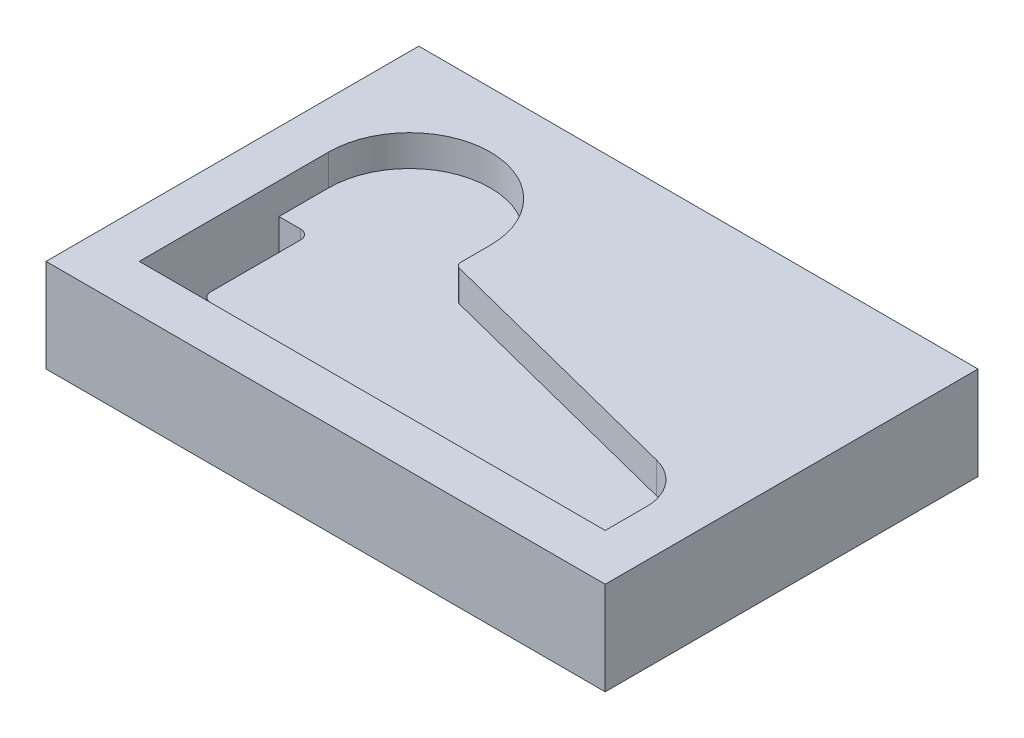
ISO-10303-21;
HEADER;
FILE_DESCRIPTION(('STEP AP214'),'2;1');
FILE_NAME('part.step','',(''),(''),'','','');
FILE_SCHEMA(('AUTOMOTIVE_DESIGN { 1 0 10303 214 1 1 1 1 }'));
ENDSEC;
DATA;
#1=APPLICATION_CONTEXT('core data for automotive mechanical design processes');
#2=APPLICATION_PROTOCOL_DEFINITION('international standard','automotive_design',2000,#1);
#3=PRODUCT_CONTEXT('',#1,'mechanical');
#4=PRODUCT('Part','Part','',(#3));
#5=PRODUCT_RELATED_PRODUCT_CATEGORY('part','',(#4));
#6=PRODUCT_DEFINITION_FORMATION('','',#4);
#7=PRODUCT_DEFINITION_CONTEXT('part definition',#1,'design');
#8=PRODUCT_DEFINITION('design','',#6,#7);
#9=PRODUCT_DEFINITION_SHAPE('','',#8);
#10=(LENGTH_UNIT() NAMED_UNIT(*) SI_UNIT(.MILLI.,.METRE.));
#11=(NAMED_UNIT(*) PLANE_ANGLE_UNIT() SI_UNIT($,.RADIAN.));
#12=(NAMED_UNIT(*) SI_UNIT($,.STERADIAN.) SOLID_ANGLE_UNIT());
#13=UNCERTAINTY_MEASURE_WITH_UNIT(LENGTH_MEASURE(1.E-05),#10,'distance_accuracy_value','');
#14=(GEOMETRIC_REPRESENTATION_CONTEXT(3) GLOBAL_UNCERTAINTY_ASSIGNED_CONTEXT((#13)) GLOBAL_UNIT_ASSIGNED_CONTEXT((#10,
#11,#12)) REPRESENTATION_CONTEXT('',''));
#15=CARTESIAN_POINT('',(0.,0.,0.));
#16=DIRECTION('',(0.,0.,1.));
#17=DIRECTION('',(1.,0.,0.));
#18=AXIS2_PLACEMENT_3D('',#15,#16,#17);
#19=CARTESIAN_POINT('',(0.,30.,0.));
#20=DIRECTION('',(0.,-1.,0.));
#21=DIRECTION('',(0.,0.,-1.));
#22=AXIS2_PLACEMENT_3D('',#19,#20,#21);
#23=PLANE('',#22);
#24=DIRECTION('',(0.,0.,-1.));
#25=VECTOR('',#24,1.);
#26=CARTESIAN_POINT('',(90.,30.,60.));
#27=LINE('',#26,#25);
#28=CARTESIAN_POINT('',(90.,30.,60.));
#29=VERTEX_POINT('',#28);
#30=CARTESIAN_POINT('',(90.,30.,-60.));
#31=VERTEX_POINT('',#30);
#32=EDGE_CURVE('E279',#29,#31,#27,.T.);
#33=ORIENTED_EDGE('',*,*,#32,.T.);
#34=DIRECTION('',(-1.,0.,0.));
#35=VECTOR('',#34,1.);
#36=CARTESIAN_POINT('',(-90.,30.,-60.));
#37=LINE('',#36,#35);
#38=CARTESIAN_POINT('',(-90.,30.,-60.));
#39=VERTEX_POINT('',#38);
#40=EDGE_CURVE('E282',#31,#39,#37,.T.);
#41=ORIENTED_EDGE('',*,*,#40,.T.);
#42=DIRECTION('',(0.,0.,1.));
#43=VECTOR('',#42,1.);
#44=CARTESIAN_POINT('',(-90.,30.,60.));
#45=LINE('',#44,#43);
#46=CARTESIAN_POINT('',(-90.,30.,60.));
#47=VERTEX_POINT('',#46);
#48=EDGE_CURVE('E285',#39,#47,#45,.T.);
#49=ORIENTED_EDGE('',*,*,#48,.T.);
#50=DIRECTION('',(1.,0.,0.));
#51=VECTOR('',#50,1.);
#52=CARTESIAN_POINT('',(-90.,30.,60.));
#53=LINE('',#52,#51);
#54=EDGE_CURVE('E287',#47,#29,#53,.T.);
#55=ORIENTED_EDGE('',*,*,#54,.T.);
#56=EDGE_LOOP('',(#33,#41,#49,#55));
#57=FACE_BOUND('',#56,.T.);
#58=DIRECTION('',(0.,0.,-1.));
#59=VECTOR('',#58,1.);
#60=CARTESIAN_POINT('',(75.,30.,20.));
#61=LINE('',#60,#59);
#62=CARTESIAN_POINT('',(75.,30.,45.));
#63=VERTEX_POINT('',#62);
#64=CARTESIAN_POINT('',(75.,30.,31.6538549296739));
#65=VERTEX_POINT('',#64);
#66=EDGE_CURVE('E186',#63,#65,#61,.T.);
#67=ORIENTED_EDGE('',*,*,#66,.F.);
#68=DIRECTION('',(-1.,0.,0.));
#69=VECTOR('',#68,1.);
#70=CARTESIAN_POINT('',(0.,30.,45.));
#71=LINE('',#70,#69);
#72=CARTESIAN_POINT('',(-75.,30.,45.));
#73=VERTEX_POINT('',#72);
#74=EDGE_CURVE('E170',#63,#73,#71,.T.);
#75=ORIENTED_EDGE('',*,*,#74,.T.);
#76=DIRECTION('',(0.,0.,1.));
#77=VECTOR('',#76,1.);
#78=CARTESIAN_POINT('',(-75.,30.,0.));
#79=LINE('',#78,#77);
#80=CARTESIAN_POINT('',(-75.,30.,-16.));
#81=VERTEX_POINT('',#80);
#82=EDGE_CURVE('E214',#81,#73,#79,.T.);
#83=ORIENTED_EDGE('',*,*,#82,.F.);
#84=CARTESIAN_POINT('',(-49.,30.,-16.));
#85=DIRECTION('',(0.,1.,0.));
#86=DIRECTION('',(0.,0.,1.));
#87=AXIS2_PLACEMENT_3D('',#84,#85,#86);
#88=CIRCLE('',#87,26.);
#89=CARTESIAN_POINT('',(-23.,30.,-16.));
#90=VERTEX_POINT('',#89);
#91=EDGE_CURVE('E243',#90,#81,#88,.T.);
#92=ORIENTED_EDGE('',*,*,#91,.F.);
#93=DIRECTION('',(0.,0.,1.));
#94=VECTOR('',#93,1.);
#95=CARTESIAN_POINT('',(-23.,30.,0.));
#96=LINE('',#95,#94);
#97=CARTESIAN_POINT('',(-23.,30.,-6.55384732395652));
#98=VERTEX_POINT('',#97);
#99=EDGE_CURVE('E219',#90,#98,#96,.T.);
#100=ORIENTED_EDGE('',*,*,#99,.T.);
#101=CARTESIAN_POINT('',(-21.,30.,-6.55384732395652));
#102=DIRECTION('',(0.,1.,0.));
#103=DIRECTION('',(0.,0.,1.));
#104=AXIS2_PLACEMENT_3D('',#101,#102,#103);
#105=CIRCLE('',#104,2.);
#106=CARTESIAN_POINT('',(-21.4943714873099,30.,-4.61591109370152));
#107=VERTEX_POINT('',#106);
#108=EDGE_CURVE('E274',#107,#98,#105,.F.);
#109=ORIENTED_EDGE('',*,*,#108,.F.);
#110=DIRECTION('',(-0.968968115127499,0.,-0.247185743654974));
#111=VECTOR('',#110,1.);
#112=CARTESIAN_POINT('',(-23.,30.,-5.));
#113=LINE('',#112,#111);
#114=CARTESIAN_POINT('',(63.7077861548246,30.,17.1193332027614));
#115=VERTEX_POINT('',#114);
#116=EDGE_CURVE('E58',#115,#107,#113,.T.);
#117=ORIENTED_EDGE('',*,*,#116,.F.);
#118=CARTESIAN_POINT('',(60.,30.,31.6538549296739));
#119=DIRECTION('',(0.,1.,0.));
#120=DIRECTION('',(0.,0.,1.));
#121=AXIS2_PLACEMENT_3D('',#118,#119,#120);
#122=CIRCLE('',#121,15.);
#123=EDGE_CURVE('E193',#65,#115,#122,.T.);
#124=ORIENTED_EDGE('',*,*,#123,.F.);
#125=EDGE_LOOP('',(#67,#75,#83,#92,#100,#109,#117,#124));
#126=FACE_BOUND('',#125,.T.);
#127=ADVANCED_FACE('F43',(#57,#126),#23,.F.);
#128=CARTESIAN_POINT('',(0.,0.,0.));
#129=DIRECTION('',(0.,-1.,0.));
#130=DIRECTION('',(0.,0.,-1.));
#131=AXIS2_PLACEMENT_3D('',#128,#129,#130);
#132=PLANE('',#131);
#133=DIRECTION('',(0.,0.,-1.));
#134=VECTOR('',#133,1.);
#135=CARTESIAN_POINT('',(90.,0.,60.));
#136=LINE('',#135,#134);
#137=CARTESIAN_POINT('',(90.,0.,60.));
#138=VERTEX_POINT('',#137);
#139=CARTESIAN_POINT('',(90.,0.,-60.));
#140=VERTEX_POINT('',#139);
#141=EDGE_CURVE('E278',#138,#140,#136,.T.);
#142=ORIENTED_EDGE('',*,*,#141,.F.);
#143=DIRECTION('',(1.,0.,0.));
#144=VECTOR('',#143,1.);
#145=CARTESIAN_POINT('',(-90.,0.,60.));
#146=LINE('',#145,#144);
#147=CARTESIAN_POINT('',(-90.,0.,60.));
#148=VERTEX_POINT('',#147);
#149=EDGE_CURVE('E283',#148,#138,#146,.T.);
#150=ORIENTED_EDGE('',*,*,#149,.F.);
#151=DIRECTION('',(0.,0.,1.));
#152=VECTOR('',#151,1.);
#153=CARTESIAN_POINT('',(-90.,0.,60.));
#154=LINE('',#153,#152);
#155=CARTESIAN_POINT('',(-90.,0.,-60.));
#156=VERTEX_POINT('',#155);
#157=EDGE_CURVE('E294',#156,#148,#154,.T.);
#158=ORIENTED_EDGE('',*,*,#157,.F.);
#159=DIRECTION('',(-1.,0.,0.));
#160=VECTOR('',#159,1.);
#161=CARTESIAN_POINT('',(-90.,0.,-60.));
#162=LINE('',#161,#160);
#163=EDGE_CURVE('E292',#140,#156,#162,.T.);
#164=ORIENTED_EDGE('',*,*,#163,.F.);
#165=EDGE_LOOP('',(#142,#150,#158,#164));
#166=FACE_BOUND('',#165,.T.);
#167=DIRECTION('',(1.,0.,0.));
#168=VECTOR('',#167,1.);
#169=CARTESIAN_POINT('',(-75.,0.,0.));
#170=LINE('',#169,#168);
#171=CARTESIAN_POINT('',(-75.,0.,0.));
#172=VERTEX_POINT('',#171);
#173=CARTESIAN_POINT('',(-68.,0.,0.));
#174=VERTEX_POINT('',#173);
#175=EDGE_CURVE('E233',#172,#174,#170,.T.);
#176=ORIENTED_EDGE('',*,*,#175,.F.);
#177=DIRECTION('',(0.,0.,1.));
#178=VECTOR('',#177,1.);
#179=CARTESIAN_POINT('',(-75.,0.,35.));
#180=LINE('',#179,#178);
#181=CARTESIAN_POINT('',(-75.,0.,45.));
#182=VERTEX_POINT('',#181);
#183=EDGE_CURVE('E194',#172,#182,#180,.T.);
#184=ORIENTED_EDGE('',*,*,#183,.T.);
#185=DIRECTION('',(-1.,0.,0.));
#186=VECTOR('',#185,1.);
#187=CARTESIAN_POINT('',(0.,0.,45.));
#188=LINE('',#187,#186);
#189=CARTESIAN_POINT('',(75.,0.,45.));
#190=VERTEX_POINT('',#189);
#191=EDGE_CURVE('E199',#190,#182,#188,.T.);
#192=ORIENTED_EDGE('',*,*,#191,.F.);
#193=DIRECTION('',(0.,0.,-1.));
#194=VECTOR('',#193,1.);
#195=CARTESIAN_POINT('',(75.,0.,35.));
#196=LINE('',#195,#194);
#197=CARTESIAN_POINT('',(75.,0.,35.));
#198=VERTEX_POINT('',#197);
#199=EDGE_CURVE('E180',#190,#198,#196,.T.);
#200=ORIENTED_EDGE('',*,*,#199,.T.);
#201=DIRECTION('',(1.,0.,0.));
#202=VECTOR('',#201,1.);
#203=CARTESIAN_POINT('',(-75.,0.,35.));
#204=LINE('',#203,#202);
#205=CARTESIAN_POINT('',(-62.,0.,35.));
#206=VERTEX_POINT('',#205);
#207=EDGE_CURVE('E209',#206,#198,#204,.T.);
#208=ORIENTED_EDGE('',*,*,#207,.F.);
#209=CARTESIAN_POINT('',(-62.,0.,32.));
#210=DIRECTION('',(0.,1.,0.));
#211=DIRECTION('',(0.,0.,1.));
#212=AXIS2_PLACEMENT_3D('',#209,#210,#211);
#213=CIRCLE('',#212,3.);
#214=CARTESIAN_POINT('',(-65.,0.,32.));
#215=VERTEX_POINT('',#214);
#216=EDGE_CURVE('E268',#215,#206,#213,.T.);
#217=ORIENTED_EDGE('',*,*,#216,.F.);
#218=DIRECTION('',(0.,0.,1.));
#219=VECTOR('',#218,1.);
#220=CARTESIAN_POINT('',(-65.,0.,45.));
#221=LINE('',#220,#219);
#222=CARTESIAN_POINT('',(-65.,0.,3.));
#223=VERTEX_POINT('',#222);
#224=EDGE_CURVE('E224',#223,#215,#221,.T.);
#225=ORIENTED_EDGE('',*,*,#224,.F.);
#226=CARTESIAN_POINT('',(-68.,0.,3.));
#227=DIRECTION('',(0.,1.,0.));
#228=DIRECTION('',(0.,0.,1.));
#229=AXIS2_PLACEMENT_3D('',#226,#227,#228);
#230=CIRCLE('',#229,3.);
#231=EDGE_CURVE('E258',#174,#223,#230,.F.);
#232=ORIENTED_EDGE('',*,*,#231,.F.);
#233=EDGE_LOOP('',(#176,#184,#192,#200,#208,#217,#225,#232));
#234=FACE_BOUND('',#233,.T.);
#235=ADVANCED_FACE('F312',(#166,#234),#132,.T.);
#236=CARTESIAN_POINT('',(90.,30.,60.));
#237=DIRECTION('',(-1.,0.,0.));
#238=DIRECTION('',(0.,0.,1.));
#239=AXIS2_PLACEMENT_3D('',#236,#237,#238);
#240=PLANE('',#239);
#241=ORIENTED_EDGE('',*,*,#141,.T.);
#242=DIRECTION('',(0.,-1.,0.));
#243=VECTOR('',#242,1.);
#244=CARTESIAN_POINT('',(90.,30.,-60.));
#245=LINE('',#244,#243);
#246=EDGE_CURVE('E11',#31,#140,#245,.T.);
#247=ORIENTED_EDGE('',*,*,#246,.F.);
#248=ORIENTED_EDGE('',*,*,#32,.F.);
#249=DIRECTION('',(0.,-1.,0.));
#250=VECTOR('',#249,1.);
#251=CARTESIAN_POINT('',(90.,30.,60.));
#252=LINE('',#251,#250);
#253=EDGE_CURVE('E289',#29,#138,#252,.T.);
#254=ORIENTED_EDGE('',*,*,#253,.T.);
#255=EDGE_LOOP('',(#241,#247,#248,#254));
#256=FACE_BOUND('',#255,.T.);
#257=ADVANCED_FACE('F45',(#256),#240,.F.);
#258=CARTESIAN_POINT('',(-90.,30.,-60.));
#259=DIRECTION('',(0.,0.,1.));
#260=DIRECTION('',(1.,0.,0.));
#261=AXIS2_PLACEMENT_3D('',#258,#259,#260);
#262=PLANE('',#261);
#263=ORIENTED_EDGE('',*,*,#163,.T.);
#264=DIRECTION('',(0.,-1.,0.));
#265=VECTOR('',#264,1.);
#266=CARTESIAN_POINT('',(-90.,30.,-60.));
#267=LINE('',#266,#265);
#268=EDGE_CURVE('E51',#39,#156,#267,.T.);
#269=ORIENTED_EDGE('',*,*,#268,.F.);
#270=ORIENTED_EDGE('',*,*,#40,.F.);
#271=ORIENTED_EDGE('',*,*,#246,.T.);
#272=EDGE_LOOP('',(#263,#269,#270,#271));
#273=FACE_BOUND('',#272,.T.);
#274=ADVANCED_FACE('F322',(#273),#262,.F.);
#275=CARTESIAN_POINT('',(-90.,30.,60.));
#276=DIRECTION('',(1.,0.,0.));
#277=DIRECTION('',(0.,0.,-1.));
#278=AXIS2_PLACEMENT_3D('',#275,#276,#277);
#279=PLANE('',#278);
#280=ORIENTED_EDGE('',*,*,#157,.T.);
#281=DIRECTION('',(0.,-1.,0.));
#282=VECTOR('',#281,1.);
#283=CARTESIAN_POINT('',(-90.,30.,60.));
#284=LINE('',#283,#282);
#285=EDGE_CURVE('E299',#47,#148,#284,.T.);
#286=ORIENTED_EDGE('',*,*,#285,.F.);
#287=ORIENTED_EDGE('',*,*,#48,.F.);
#288=ORIENTED_EDGE('',*,*,#268,.T.);
#289=EDGE_LOOP('',(#280,#286,#287,#288));
#290=FACE_BOUND('',#289,.T.);
#291=ADVANCED_FACE('F306',(#290),#279,.F.);
#292=CARTESIAN_POINT('',(-90.,30.,60.));
#293=DIRECTION('',(0.,0.,-1.));
#294=DIRECTION('',(-1.,0.,0.));
#295=AXIS2_PLACEMENT_3D('',#292,#293,#294);
#296=PLANE('',#295);
#297=ORIENTED_EDGE('',*,*,#149,.T.);
#298=ORIENTED_EDGE('',*,*,#253,.F.);
#299=ORIENTED_EDGE('',*,*,#54,.F.);
#300=ORIENTED_EDGE('',*,*,#285,.T.);
#301=EDGE_LOOP('',(#297,#298,#299,#300));
#302=FACE_BOUND('',#301,.T.);
#303=ADVANCED_FACE('F316',(#302),#296,.F.);
#304=CARTESIAN_POINT('',(-75.,51.,35.));
#305=DIRECTION('',(1.,0.,0.));
#306=DIRECTION('',(0.,-1.,0.));
#307=AXIS2_PLACEMENT_3D('',#304,#305,#306);
#308=PLANE('',#307);
#309=DIRECTION('',(0.,1.,0.));
#310=VECTOR('',#309,1.);
#311=CARTESIAN_POINT('',(-75.,51.,45.));
#312=LINE('',#311,#310);
#313=EDGE_CURVE('E176',#182,#73,#312,.T.);
#314=ORIENTED_EDGE('',*,*,#313,.F.);
#315=ORIENTED_EDGE('',*,*,#183,.F.);
#316=DIRECTION('',(0.,-1.,0.));
#317=VECTOR('',#316,1.);
#318=CARTESIAN_POINT('',(-75.,51.,0.));
#319=LINE('',#318,#317);
#320=CARTESIAN_POINT('',(-75.,20.,0.));
#321=VERTEX_POINT('',#320);
#322=EDGE_CURVE('E226',#321,#172,#319,.T.);
#323=ORIENTED_EDGE('',*,*,#322,.F.);
#324=DIRECTION('',(0.,0.,-1.));
#325=VECTOR('',#324,1.);
#326=CARTESIAN_POINT('',(-75.,20.,0.));
#327=LINE('',#326,#325);
#328=CARTESIAN_POINT('',(-75.,20.,-16.));
#329=VERTEX_POINT('',#328);
#330=EDGE_CURVE('E216',#321,#329,#327,.T.);
#331=ORIENTED_EDGE('',*,*,#330,.T.);
#332=DIRECTION('',(0.,-1.,0.));
#333=VECTOR('',#332,1.);
#334=CARTESIAN_POINT('',(-75.,20.,-16.));
#335=LINE('',#334,#333);
#336=EDGE_CURVE('E237',#81,#329,#335,.T.);
#337=ORIENTED_EDGE('',*,*,#336,.F.);
#338=ORIENTED_EDGE('',*,*,#82,.T.);
#339=EDGE_LOOP('',(#314,#315,#323,#331,#337,#338));
#340=FACE_BOUND('',#339,.T.);
#341=ADVANCED_FACE('F339',(#340),#308,.T.);
#342=CARTESIAN_POINT('',(75.,51.,35.));
#343=DIRECTION('',(-1.,0.,0.));
#344=DIRECTION('',(0.,1.,0.));
#345=AXIS2_PLACEMENT_3D('',#342,#343,#344);
#346=PLANE('',#345);
#347=ORIENTED_EDGE('',*,*,#66,.T.);
#348=DIRECTION('',(0.,1.,0.));
#349=VECTOR('',#348,1.);
#350=CARTESIAN_POINT('',(75.,30.,31.6538549296739));
#351=LINE('',#350,#349);
#352=CARTESIAN_POINT('',(75.,20.,31.6538549296739));
#353=VERTEX_POINT('',#352);
#354=EDGE_CURVE('E245',#353,#65,#351,.T.);
#355=ORIENTED_EDGE('',*,*,#354,.F.);
#356=DIRECTION('',(0.,0.,-1.));
#357=VECTOR('',#356,1.);
#358=CARTESIAN_POINT('',(75.,20.,20.));
#359=LINE('',#358,#357);
#360=CARTESIAN_POINT('',(75.,20.,35.));
#361=VERTEX_POINT('',#360);
#362=EDGE_CURVE('E196',#361,#353,#359,.T.);
#363=ORIENTED_EDGE('',*,*,#362,.F.);
#364=DIRECTION('',(0.,-1.,0.));
#365=VECTOR('',#364,1.);
#366=CARTESIAN_POINT('',(75.,51.,35.));
#367=LINE('',#366,#365);
#368=EDGE_CURVE('E191',#361,#198,#367,.T.);
#369=ORIENTED_EDGE('',*,*,#368,.T.);
#370=ORIENTED_EDGE('',*,*,#199,.F.);
#371=DIRECTION('',(0.,-1.,0.));
#372=VECTOR('',#371,1.);
#373=CARTESIAN_POINT('',(75.,51.,45.));
#374=LINE('',#373,#372);
#375=EDGE_CURVE('E173',#63,#190,#374,.T.);
#376=ORIENTED_EDGE('',*,*,#375,.F.);
#377=EDGE_LOOP('',(#347,#355,#363,#369,#370,#376));
#378=FACE_BOUND('',#377,.T.);
#379=ADVANCED_FACE('F184',(#378),#346,.T.);
#380=CARTESIAN_POINT('',(0.,9.99999999999999,45.));
#381=DIRECTION('',(0.,0.,1.));
#382=DIRECTION('',(-1.,0.,0.));
#383=AXIS2_PLACEMENT_3D('',#380,#381,#382);
#384=PLANE('',#383);
#385=ORIENTED_EDGE('',*,*,#375,.T.);
#386=ORIENTED_EDGE('',*,*,#191,.T.);
#387=ORIENTED_EDGE('',*,*,#313,.T.);
#388=ORIENTED_EDGE('',*,*,#74,.F.);
#389=EDGE_LOOP('',(#385,#386,#387,#388));
#390=FACE_BOUND('',#389,.T.);
#391=ADVANCED_FACE('F172',(#390),#384,.F.);
#392=CARTESIAN_POINT('',(0.,10.,35.));
#393=DIRECTION('',(0.,0.,1.));
#394=DIRECTION('',(-1.,0.,0.));
#395=AXIS2_PLACEMENT_3D('',#392,#393,#394);
#396=PLANE('',#395);
#397=ORIENTED_EDGE('',*,*,#207,.T.);
#398=ORIENTED_EDGE('',*,*,#368,.F.);
#399=DIRECTION('',(1.,0.,0.));
#400=VECTOR('',#399,1.);
#401=CARTESIAN_POINT('',(-75.,20.,35.));
#402=LINE('',#401,#400);
#403=CARTESIAN_POINT('',(-62.,20.,35.));
#404=VERTEX_POINT('',#403);
#405=EDGE_CURVE('E206',#404,#361,#402,.T.);
#406=ORIENTED_EDGE('',*,*,#405,.F.);
#407=DIRECTION('',(0.,1.,0.));
#408=VECTOR('',#407,1.);
#409=CARTESIAN_POINT('',(-62.,10.,35.));
#410=LINE('',#409,#408);
#411=EDGE_CURVE('E262',#206,#404,#410,.T.);
#412=ORIENTED_EDGE('',*,*,#411,.F.);
#413=EDGE_LOOP('',(#397,#398,#406,#412));
#414=FACE_BOUND('',#413,.T.);
#415=ADVANCED_FACE('F358',(#414),#396,.T.);
#416=CARTESIAN_POINT('',(-49.,20.,-16.));
#417=DIRECTION('',(0.,1.,0.));
#418=DIRECTION('',(1.,0.,0.));
#419=AXIS2_PLACEMENT_3D('',#416,#417,#418);
#420=CYLINDRICAL_SURFACE('',#419,26.);
#421=DIRECTION('',(0.,-1.,0.));
#422=VECTOR('',#421,1.);
#423=CARTESIAN_POINT('',(-23.,20.,-16.));
#424=LINE('',#423,#422);
#425=CARTESIAN_POINT('',(-23.,20.,-16.));
#426=VERTEX_POINT('',#425);
#427=EDGE_CURVE('E235',#426,#90,#424,.F.);
#428=ORIENTED_EDGE('',*,*,#427,.T.);
#429=ORIENTED_EDGE('',*,*,#91,.T.);
#430=ORIENTED_EDGE('',*,*,#336,.T.);
#431=CARTESIAN_POINT('',(-49.,20.,-16.));
#432=DIRECTION('',(0.,-1.,0.));
#433=DIRECTION('',(0.,0.,-1.));
#434=AXIS2_PLACEMENT_3D('',#431,#432,#433);
#435=CIRCLE('',#434,26.);
#436=EDGE_CURVE('E240',#329,#426,#435,.T.);
#437=ORIENTED_EDGE('',*,*,#436,.T.);
#438=EDGE_LOOP('',(#428,#429,#430,#437));
#439=FACE_BOUND('',#438,.T.);
#440=ADVANCED_FACE('F352',(#439),#420,.F.);
#441=CARTESIAN_POINT('',(-65.,51.,45.));
#442=DIRECTION('',(1.,0.,0.));
#443=DIRECTION('',(0.,-1.,0.));
#444=AXIS2_PLACEMENT_3D('',#441,#442,#443);
#445=PLANE('',#444);
#446=DIRECTION('',(0.,0.,-1.));
#447=VECTOR('',#446,1.);
#448=CARTESIAN_POINT('',(-65.,20.,45.));
#449=LINE('',#448,#447);
#450=CARTESIAN_POINT('',(-65.,20.,32.));
#451=VERTEX_POINT('',#450);
#452=CARTESIAN_POINT('',(-65.,20.,3.));
#453=VERTEX_POINT('',#452);
#454=EDGE_CURVE('E211',#451,#453,#449,.T.);
#455=ORIENTED_EDGE('',*,*,#454,.T.);
#456=DIRECTION('',(0.,-1.,0.));
#457=VECTOR('',#456,1.);
#458=CARTESIAN_POINT('',(-65.,51.,3.));
#459=LINE('',#458,#457);
#460=EDGE_CURVE('E255',#223,#453,#459,.F.);
#461=ORIENTED_EDGE('',*,*,#460,.F.);
#462=ORIENTED_EDGE('',*,*,#224,.T.);
#463=DIRECTION('',(0.,1.,0.));
#464=VECTOR('',#463,1.);
#465=CARTESIAN_POINT('',(-65.,51.,32.));
#466=LINE('',#465,#464);
#467=EDGE_CURVE('E66',#451,#215,#466,.F.);
#468=ORIENTED_EDGE('',*,*,#467,.F.);
#469=EDGE_LOOP('',(#455,#461,#462,#468));
#470=FACE_BOUND('',#469,.T.);
#471=ADVANCED_FACE('F357',(#470),#445,.F.);
#472=CARTESIAN_POINT('',(-75.,51.,0.));
#473=DIRECTION('',(0.,0.,-1.));
#474=DIRECTION('',(1.,0.,0.));
#475=AXIS2_PLACEMENT_3D('',#472,#473,#474);
#476=PLANE('',#475);
#477=DIRECTION('',(-1.,0.,0.));
#478=VECTOR('',#477,1.);
#479=CARTESIAN_POINT('',(-75.,20.,0.));
#480=LINE('',#479,#478);
#481=CARTESIAN_POINT('',(-68.,20.,0.));
#482=VERTEX_POINT('',#481);
#483=EDGE_CURVE('E230',#482,#321,#480,.T.);
#484=ORIENTED_EDGE('',*,*,#483,.T.);
#485=ORIENTED_EDGE('',*,*,#322,.T.);
#486=ORIENTED_EDGE('',*,*,#175,.T.);
#487=DIRECTION('',(0.,-1.,0.));
#488=VECTOR('',#487,1.);
#489=CARTESIAN_POINT('',(-68.,51.,0.));
#490=LINE('',#489,#488);
#491=EDGE_CURVE('E252',#482,#174,#490,.T.);
#492=ORIENTED_EDGE('',*,*,#491,.F.);
#493=EDGE_LOOP('',(#484,#485,#486,#492));
#494=FACE_BOUND('',#493,.T.);
#495=ADVANCED_FACE('F387',(#494),#476,.F.);
#496=CARTESIAN_POINT('',(-75.,20.,0.));
#497=DIRECTION('',(0.,-1.,0.));
#498=DIRECTION('',(0.,0.,-1.));
#499=AXIS2_PLACEMENT_3D('',#496,#497,#498);
#500=PLANE('',#499);
#501=ORIENTED_EDGE('',*,*,#405,.T.);
#502=ORIENTED_EDGE('',*,*,#362,.T.);
#503=CARTESIAN_POINT('',(60.,20.,31.6538549296739));
#504=DIRECTION('',(0.,-1.,0.));
#505=DIRECTION('',(0.,0.,-1.));
#506=AXIS2_PLACEMENT_3D('',#503,#504,#505);
#507=CIRCLE('',#506,15.);
#508=CARTESIAN_POINT('',(63.7077861548246,20.,17.1193332027614));
#509=VERTEX_POINT('',#508);
#510=EDGE_CURVE('E250',#509,#353,#507,.T.);
#511=ORIENTED_EDGE('',*,*,#510,.F.);
#512=DIRECTION('',(-0.968968115127499,0.,-0.247185743654974));
#513=VECTOR('',#512,1.);
#514=CARTESIAN_POINT('',(-23.,20.,-5.));
#515=LINE('',#514,#513);
#516=CARTESIAN_POINT('',(-21.4943714873099,20.,-4.61591109370152));
#517=VERTEX_POINT('',#516);
#518=EDGE_CURVE('E203',#509,#517,#515,.T.);
#519=ORIENTED_EDGE('',*,*,#518,.T.);
#520=CARTESIAN_POINT('',(-21.,20.,-6.55384732395652));
#521=DIRECTION('',(0.,-1.,0.));
#522=DIRECTION('',(0.,0.,-1.));
#523=AXIS2_PLACEMENT_3D('',#520,#521,#522);
#524=CIRCLE('',#523,2.);
#525=CARTESIAN_POINT('',(-23.,20.,-6.55384732395652));
#526=VERTEX_POINT('',#525);
#527=EDGE_CURVE('E276',#526,#517,#524,.F.);
#528=ORIENTED_EDGE('',*,*,#527,.F.);
#529=DIRECTION('',(0.,0.,-1.));
#530=VECTOR('',#529,1.);
#531=CARTESIAN_POINT('',(-23.,20.,0.));
#532=LINE('',#531,#530);
#533=EDGE_CURVE('E212',#526,#426,#532,.T.);
#534=ORIENTED_EDGE('',*,*,#533,.T.);
#535=ORIENTED_EDGE('',*,*,#436,.F.);
#536=ORIENTED_EDGE('',*,*,#330,.F.);
#537=ORIENTED_EDGE('',*,*,#483,.F.);
#538=CARTESIAN_POINT('',(-68.,20.,3.));
#539=DIRECTION('',(0.,-1.,0.));
#540=DIRECTION('',(0.,0.,-1.));
#541=AXIS2_PLACEMENT_3D('',#538,#539,#540);
#542=CIRCLE('',#541,3.);
#543=EDGE_CURVE('E260',#453,#482,#542,.F.);
#544=ORIENTED_EDGE('',*,*,#543,.F.);
#545=ORIENTED_EDGE('',*,*,#454,.F.);
#546=CARTESIAN_POINT('',(-62.,20.,32.));
#547=DIRECTION('',(0.,-1.,0.));
#548=DIRECTION('',(0.,0.,-1.));
#549=AXIS2_PLACEMENT_3D('',#546,#547,#548);
#550=CIRCLE('',#549,3.);
#551=EDGE_CURVE('E265',#404,#451,#550,.T.);
#552=ORIENTED_EDGE('',*,*,#551,.F.);
#553=EDGE_LOOP('',(#501,#502,#511,#519,#528,#534,#535,#536,#537,#544,#545,#552));
#554=FACE_BOUND('',#553,.T.);
#555=ADVANCED_FACE('F394',(#554),#500,.F.);
#556=CARTESIAN_POINT('',(-23.,9.99999999999999,45.));
#557=DIRECTION('',(-1.,0.,0.));
#558=DIRECTION('',(0.,1.,0.));
#559=AXIS2_PLACEMENT_3D('',#556,#557,#558);
#560=PLANE('',#559);
#561=ORIENTED_EDGE('',*,*,#99,.F.);
#562=ORIENTED_EDGE('',*,*,#427,.F.);
#563=ORIENTED_EDGE('',*,*,#533,.F.);
#564=DIRECTION('',(0.,1.,0.));
#565=VECTOR('',#564,1.);
#566=CARTESIAN_POINT('',(-23.,9.99999999999999,-6.55384732395652));
#567=LINE('',#566,#565);
#568=EDGE_CURVE('E272',#98,#526,#567,.F.);
#569=ORIENTED_EDGE('',*,*,#568,.F.);
#570=EDGE_LOOP('',(#561,#562,#563,#569));
#571=FACE_BOUND('',#570,.T.);
#572=ADVANCED_FACE('F402',(#571),#560,.T.);
#573=CARTESIAN_POINT('',(-23.,-85.8489489791939,-5.));
#574=DIRECTION('',(0.247185743654974,0.,-0.968968115127499));
#575=DIRECTION('',(0.968968115127499,0.,0.247185743654974));
#576=AXIS2_PLACEMENT_3D('',#573,#574,#575);
#577=PLANE('',#576);
#578=ORIENTED_EDGE('',*,*,#518,.F.);
#579=DIRECTION('',(0.,1.,0.));
#580=VECTOR('',#579,1.);
#581=CARTESIAN_POINT('',(63.7077861548246,20.,17.1193332027614));
#582=LINE('',#581,#580);
#583=EDGE_CURVE('E248',#115,#509,#582,.F.);
#584=ORIENTED_EDGE('',*,*,#583,.F.);
#585=ORIENTED_EDGE('',*,*,#116,.T.);
#586=DIRECTION('',(0.,1.,0.));
#587=VECTOR('',#586,1.);
#588=CARTESIAN_POINT('',(-21.4943714873099,-85.8489489791939,-4.61591109370151));
#589=LINE('',#588,#587);
#590=EDGE_CURVE('E270',#517,#107,#589,.T.);
#591=ORIENTED_EDGE('',*,*,#590,.F.);
#592=EDGE_LOOP('',(#578,#584,#585,#591));
#593=FACE_BOUND('',#592,.T.);
#594=ADVANCED_FACE('F364',(#593),#577,.F.);
#595=CARTESIAN_POINT('',(60.,51.,31.6538549296739));
#596=DIRECTION('',(0.,-1.,0.));
#597=DIRECTION('',(0.,0.,-1.));
#598=AXIS2_PLACEMENT_3D('',#595,#596,#597);
#599=CYLINDRICAL_SURFACE('',#598,15.);
#600=ORIENTED_EDGE('',*,*,#510,.T.);
#601=ORIENTED_EDGE('',*,*,#354,.T.);
#602=ORIENTED_EDGE('',*,*,#123,.T.);
#603=ORIENTED_EDGE('',*,*,#583,.T.);
#604=EDGE_LOOP('',(#600,#601,#602,#603));
#605=FACE_BOUND('',#604,.T.);
#606=ADVANCED_FACE('F360',(#605),#599,.F.);
#607=CARTESIAN_POINT('',(-68.,51.,3.));
#608=DIRECTION('',(0.,-1.,0.));
#609=DIRECTION('',(-1.,0.,0.));
#610=AXIS2_PLACEMENT_3D('',#607,#608,#609);
#611=CYLINDRICAL_SURFACE('',#610,3.);
#612=ORIENTED_EDGE('',*,*,#543,.T.);
#613=ORIENTED_EDGE('',*,*,#491,.T.);
#614=ORIENTED_EDGE('',*,*,#231,.T.);
#615=ORIENTED_EDGE('',*,*,#460,.T.);
#616=EDGE_LOOP('',(#612,#613,#614,#615));
#617=FACE_BOUND('',#616,.T.);
#618=ADVANCED_FACE('F363',(#617),#611,.F.);
#619=CARTESIAN_POINT('',(-62.,9.99999999999999,32.));
#620=DIRECTION('',(0.,1.,0.));
#621=DIRECTION('',(1.,0.,0.));
#622=AXIS2_PLACEMENT_3D('',#619,#620,#621);
#623=CYLINDRICAL_SURFACE('',#622,3.);
#624=ORIENTED_EDGE('',*,*,#216,.T.);
#625=ORIENTED_EDGE('',*,*,#411,.T.);
#626=ORIENTED_EDGE('',*,*,#551,.T.);
#627=ORIENTED_EDGE('',*,*,#467,.T.);
#628=EDGE_LOOP('',(#624,#625,#626,#627));
#629=FACE_BOUND('',#628,.T.);
#630=ADVANCED_FACE('F367',(#629),#623,.T.);
#631=CARTESIAN_POINT('',(-21.,-85.8489489791939,-6.55384732395651));
#632=DIRECTION('',(0.,1.,0.));
#633=DIRECTION('',(0.,0.,1.));
#634=AXIS2_PLACEMENT_3D('',#631,#632,#633);
#635=CYLINDRICAL_SURFACE('',#634,2.);
#636=ORIENTED_EDGE('',*,*,#527,.T.);
#637=ORIENTED_EDGE('',*,*,#590,.T.);
#638=ORIENTED_EDGE('',*,*,#108,.T.);
#639=ORIENTED_EDGE('',*,*,#568,.T.);
#640=EDGE_LOOP('',(#636,#637,#638,#639));
#641=FACE_BOUND('',#640,.T.);
#642=ADVANCED_FACE('F335',(#641),#635,.T.);
#643=CLOSED_SHELL('',(#127,#235,#257,#274,#291,#303,#341,#379,#391,#415,#440,#471,#495,#555,
#572,#594,#606,#618,#630,#642));
#644=MANIFOLD_SOLID_BREP('B2',#643);
#645=ADVANCED_BREP_SHAPE_REPRESENTATION('',(#18,#644),#14);
#646=SHAPE_DEFINITION_REPRESENTATION(#9,#645);
ENDSEC;
END-ISO-10303-21;
